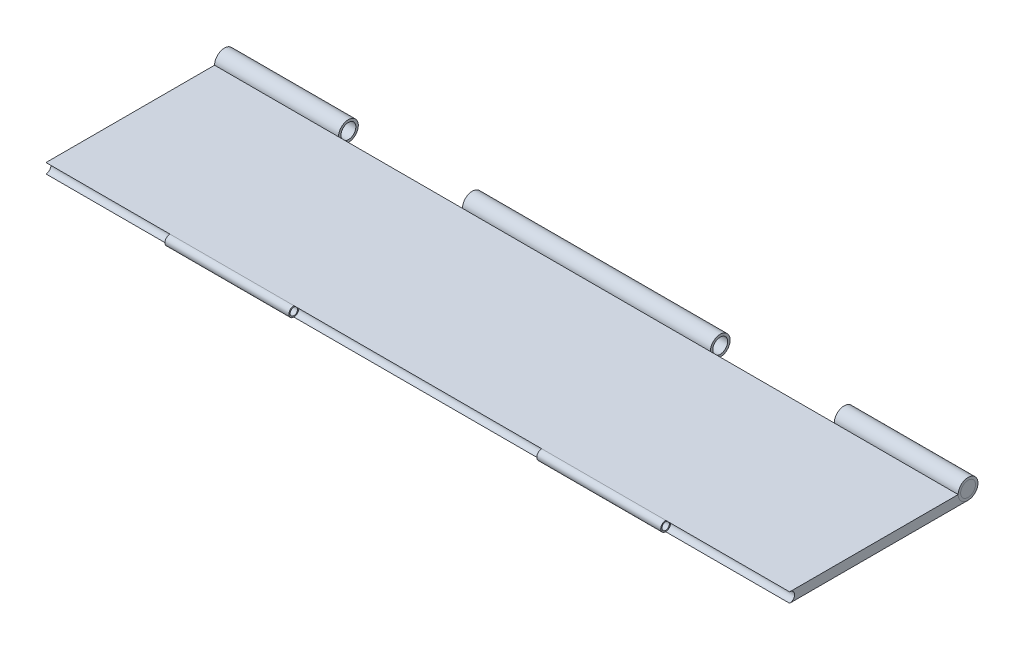
ISO-10303-21;
HEADER;
FILE_DESCRIPTION(('STEP AP214'),'2;1');
FILE_NAME('part.step','',(''),(''),'','','');
FILE_SCHEMA(('AUTOMOTIVE_DESIGN { 1 0 10303 214 1 1 1 1 }'));
ENDSEC;
DATA;
#1=APPLICATION_CONTEXT('core data for automotive mechanical design processes');
#2=APPLICATION_PROTOCOL_DEFINITION('international standard','automotive_design',2000,#1);
#3=PRODUCT_CONTEXT('',#1,'mechanical');
#4=PRODUCT('Part','Part','',(#3));
#5=PRODUCT_RELATED_PRODUCT_CATEGORY('part','',(#4));
#6=PRODUCT_DEFINITION_FORMATION('','',#4);
#7=PRODUCT_DEFINITION_CONTEXT('part definition',#1,'design');
#8=PRODUCT_DEFINITION('design','',#6,#7);
#9=PRODUCT_DEFINITION_SHAPE('','',#8);
#10=(LENGTH_UNIT() NAMED_UNIT(*) SI_UNIT(.MILLI.,.METRE.));
#11=(NAMED_UNIT(*) PLANE_ANGLE_UNIT() SI_UNIT($,.RADIAN.));
#12=(NAMED_UNIT(*) SI_UNIT($,.STERADIAN.) SOLID_ANGLE_UNIT());
#13=UNCERTAINTY_MEASURE_WITH_UNIT(LENGTH_MEASURE(1.E-05),#10,'distance_accuracy_value','');
#14=(GEOMETRIC_REPRESENTATION_CONTEXT(3) GLOBAL_UNCERTAINTY_ASSIGNED_CONTEXT((#13)) GLOBAL_UNIT_ASSIGNED_CONTEXT((#10,
#11,#12)) REPRESENTATION_CONTEXT('',''));
#15=CARTESIAN_POINT('',(0.,0.,0.));
#16=DIRECTION('',(0.,0.,1.));
#17=DIRECTION('',(1.,0.,0.));
#18=AXIS2_PLACEMENT_3D('',#15,#16,#17);
#19=CARTESIAN_POINT('',(98.0225988700565,8.,-5.95350282485887));
#20=DIRECTION('',(1.,0.,0.));
#21=DIRECTION('',(0.,0.,-1.));
#22=AXIS2_PLACEMENT_3D('',#19,#20,#21);
#23=PLANE('',#22);
#24=CARTESIAN_POINT('',(98.0225988700565,4.,-1.94350282485878));
#25=DIRECTION('',(1.,0.,0.));
#26=DIRECTION('',(0.,0.,-1.));
#27=AXIS2_PLACEMENT_3D('',#24,#25,#26);
#28=CIRCLE('',#27,4.);
#29=CARTESIAN_POINT('',(98.0225988700565,4.,-5.94350282485878));
#30=VERTEX_POINT('',#29);
#31=EDGE_CURVE('E66',#30,#30,#28,.F.);
#32=ORIENTED_EDGE('',*,*,#31,.T.);
#33=EDGE_LOOP('',(#32));
#34=FACE_BOUND('',#33,.T.);
#35=CARTESIAN_POINT('',(98.0225988700565,4.,-1.94350282485878));
#36=DIRECTION('',(1.,0.,0.));
#37=DIRECTION('',(0.,0.,-1.));
#38=AXIS2_PLACEMENT_3D('',#35,#36,#37);
#39=CIRCLE('',#38,3.);
#40=CARTESIAN_POINT('',(98.0225988700565,4.,-4.94350282485878));
#41=VERTEX_POINT('',#40);
#42=EDGE_CURVE('E74',#41,#41,#39,.F.);
#43=ORIENTED_EDGE('',*,*,#42,.F.);
#44=EDGE_LOOP('',(#43));
#45=FACE_BOUND('',#44,.T.);
#46=ADVANCED_FACE('F62',(#34,#45),#23,.F.);
#47=CARTESIAN_POINT('',(148.022598870057,4.,-1.94350282485876));
#48=DIRECTION('',(1.,0.,0.));
#49=DIRECTION('',(0.,0.,-1.));
#50=AXIS2_PLACEMENT_3D('',#47,#48,#49);
#51=PLANE('',#50);
#52=CARTESIAN_POINT('',(148.022598870057,4.,-1.94350282485876));
#53=DIRECTION('',(1.,0.,0.));
#54=DIRECTION('',(0.,0.,-1.));
#55=AXIS2_PLACEMENT_3D('',#52,#53,#54);
#56=CIRCLE('',#55,3.);
#57=CARTESIAN_POINT('',(148.022598870057,4.,-4.94350282485876));
#58=VERTEX_POINT('',#57);
#59=EDGE_CURVE('E12',#58,#58,#56,.T.);
#60=ORIENTED_EDGE('',*,*,#59,.F.);
#61=EDGE_LOOP('',(#60));
#62=FACE_BOUND('',#61,.T.);
#63=CARTESIAN_POINT('',(148.022598870057,4.,-1.94350282485876));
#64=DIRECTION('',(1.,0.,0.));
#65=DIRECTION('',(0.,0.,-1.));
#66=AXIS2_PLACEMENT_3D('',#63,#64,#65);
#67=CIRCLE('',#66,4.);
#68=CARTESIAN_POINT('',(148.022598870057,4.,-5.94350282485877));
#69=VERTEX_POINT('',#68);
#70=EDGE_CURVE('E70',#69,#69,#67,.T.);
#71=ORIENTED_EDGE('',*,*,#70,.T.);
#72=EDGE_LOOP('',(#71));
#73=FACE_BOUND('',#72,.T.);
#74=ADVANCED_FACE('F90',(#62,#73),#51,.T.);
#75=CARTESIAN_POINT('',(-151.977401129944,4.,-1.94350282485888));
#76=DIRECTION('',(1.,0.,0.));
#77=DIRECTION('',(0.,0.,-1.));
#78=AXIS2_PLACEMENT_3D('',#75,#76,#77);
#79=CYLINDRICAL_SURFACE('',#78,3.);
#80=ORIENTED_EDGE('',*,*,#42,.T.);
#81=EDGE_LOOP('',(#80));
#82=FACE_BOUND('',#81,.T.);
#83=ORIENTED_EDGE('',*,*,#59,.T.);
#84=EDGE_LOOP('',(#83));
#85=FACE_BOUND('',#84,.T.);
#86=ADVANCED_FACE('F64',(#82,#85),#79,.F.);
#87=CARTESIAN_POINT('',(-151.977401129944,4.,-1.94350282485888));
#88=DIRECTION('',(1.,0.,0.));
#89=DIRECTION('',(0.,0.,-1.));
#90=AXIS2_PLACEMENT_3D('',#87,#88,#89);
#91=CYLINDRICAL_SURFACE('',#90,4.);
#92=ORIENTED_EDGE('',*,*,#31,.F.);
#93=EDGE_LOOP('',(#92));
#94=FACE_BOUND('',#93,.T.);
#95=ORIENTED_EDGE('',*,*,#70,.F.);
#96=EDGE_LOOP('',(#95));
#97=FACE_BOUND('',#96,.T.);
#98=ADVANCED_FACE('F85',(#94,#97),#91,.T.);
#99=CLOSED_SHELL('',(#46,#74,#86,#98));
#100=MANIFOLD_SOLID_BREP('B2',#99);
#101=CARTESIAN_POINT('',(48.0225988700565,7.99999999999999,-5.95350282485887));
#102=DIRECTION('',(-1.,0.,0.));
#103=DIRECTION('',(0.,0.,1.));
#104=AXIS2_PLACEMENT_3D('',#101,#102,#103);
#105=PLANE('',#104);
#106=CARTESIAN_POINT('',(48.0225988700565,4.,-1.9435028248588));
#107=DIRECTION('',(-1.,0.,0.));
#108=DIRECTION('',(0.,0.,1.));
#109=AXIS2_PLACEMENT_3D('',#106,#107,#108);
#110=CIRCLE('',#109,4.);
#111=CARTESIAN_POINT('',(48.0225988700565,4.,2.0564971751412));
#112=VERTEX_POINT('',#111);
#113=EDGE_CURVE('E136',#112,#112,#110,.F.);
#114=ORIENTED_EDGE('',*,*,#113,.T.);
#115=EDGE_LOOP('',(#114));
#116=FACE_BOUND('',#115,.T.);
#117=CARTESIAN_POINT('',(48.0225988700565,4.,-1.9435028248588));
#118=DIRECTION('',(-1.,0.,0.));
#119=DIRECTION('',(0.,0.,1.));
#120=AXIS2_PLACEMENT_3D('',#117,#118,#119);
#121=CIRCLE('',#120,3.);
#122=CARTESIAN_POINT('',(48.0225988700565,4.,1.0564971751412));
#123=VERTEX_POINT('',#122);
#124=EDGE_CURVE('E140',#123,#123,#121,.F.);
#125=ORIENTED_EDGE('',*,*,#124,.F.);
#126=EDGE_LOOP('',(#125));
#127=FACE_BOUND('',#126,.T.);
#128=ADVANCED_FACE('F132',(#116,#127),#105,.F.);
#129=CARTESIAN_POINT('',(-51.9774011299435,8.,-5.95350282485887));
#130=DIRECTION('',(1.,0.,0.));
#131=DIRECTION('',(0.,0.,-1.));
#132=AXIS2_PLACEMENT_3D('',#129,#130,#131);
#133=PLANE('',#132);
#134=CARTESIAN_POINT('',(-51.9774011299435,4.,-1.94350282485884));
#135=DIRECTION('',(1.,0.,0.));
#136=DIRECTION('',(0.,0.,-1.));
#137=AXIS2_PLACEMENT_3D('',#134,#135,#136);
#138=CIRCLE('',#137,4.);
#139=CARTESIAN_POINT('',(-51.9774011299435,4.,-5.94350282485884));
#140=VERTEX_POINT('',#139);
#141=EDGE_CURVE('E146',#140,#140,#138,.F.);
#142=ORIENTED_EDGE('',*,*,#141,.T.);
#143=EDGE_LOOP('',(#142));
#144=FACE_BOUND('',#143,.T.);
#145=CARTESIAN_POINT('',(-51.9774011299435,4.,-1.94350282485884));
#146=DIRECTION('',(1.,0.,0.));
#147=DIRECTION('',(0.,0.,-1.));
#148=AXIS2_PLACEMENT_3D('',#145,#146,#147);
#149=CIRCLE('',#148,3.);
#150=CARTESIAN_POINT('',(-51.9774011299435,4.,-4.94350282485884));
#151=VERTEX_POINT('',#150);
#152=EDGE_CURVE('E61',#151,#151,#149,.F.);
#153=ORIENTED_EDGE('',*,*,#152,.F.);
#154=EDGE_LOOP('',(#153));
#155=FACE_BOUND('',#154,.T.);
#156=ADVANCED_FACE('F158',(#144,#155),#133,.F.);
#157=CARTESIAN_POINT('',(-151.977401129944,4.,-1.94350282485888));
#158=DIRECTION('',(1.,0.,0.));
#159=DIRECTION('',(0.,0.,-1.));
#160=AXIS2_PLACEMENT_3D('',#157,#158,#159);
#161=CYLINDRICAL_SURFACE('',#160,3.);
#162=ORIENTED_EDGE('',*,*,#124,.T.);
#163=EDGE_LOOP('',(#162));
#164=FACE_BOUND('',#163,.T.);
#165=ORIENTED_EDGE('',*,*,#152,.T.);
#166=EDGE_LOOP('',(#165));
#167=FACE_BOUND('',#166,.T.);
#168=ADVANCED_FACE('F157',(#164,#167),#161,.F.);
#169=CARTESIAN_POINT('',(-151.977401129944,4.,-1.94350282485888));
#170=DIRECTION('',(1.,0.,0.));
#171=DIRECTION('',(0.,0.,-1.));
#172=AXIS2_PLACEMENT_3D('',#169,#170,#171);
#173=CYLINDRICAL_SURFACE('',#172,4.);
#174=ORIENTED_EDGE('',*,*,#113,.F.);
#175=EDGE_LOOP('',(#174));
#176=FACE_BOUND('',#175,.T.);
#177=ORIENTED_EDGE('',*,*,#141,.F.);
#178=EDGE_LOOP('',(#177));
#179=FACE_BOUND('',#178,.T.);
#180=ADVANCED_FACE('F134',(#176,#179),#173,.T.);
#181=CLOSED_SHELL('',(#128,#156,#168,#180));
#182=MANIFOLD_SOLID_BREP('B7',#181);
#183=CARTESIAN_POINT('',(-101.977401129944,7.99999999999999,-5.95350282485887));
#184=DIRECTION('',(-1.,0.,0.));
#185=DIRECTION('',(0.,0.,1.));
#186=AXIS2_PLACEMENT_3D('',#183,#184,#185);
#187=PLANE('',#186);
#188=CARTESIAN_POINT('',(-101.977401129944,4.,-1.94350282485886));
#189=DIRECTION('',(-1.,0.,0.));
#190=DIRECTION('',(0.,0.,1.));
#191=AXIS2_PLACEMENT_3D('',#188,#189,#190);
#192=CIRCLE('',#191,4.);
#193=CARTESIAN_POINT('',(-101.977401129944,4.,2.05649717514114));
#194=VERTEX_POINT('',#193);
#195=EDGE_CURVE('E131',#194,#194,#192,.F.);
#196=ORIENTED_EDGE('',*,*,#195,.T.);
#197=EDGE_LOOP('',(#196));
#198=FACE_BOUND('',#197,.T.);
#199=CARTESIAN_POINT('',(-101.977401129944,4.,-1.94350282485886));
#200=DIRECTION('',(-1.,0.,0.));
#201=DIRECTION('',(0.,0.,1.));
#202=AXIS2_PLACEMENT_3D('',#199,#200,#201);
#203=CIRCLE('',#202,3.);
#204=CARTESIAN_POINT('',(-101.977401129944,4.,1.05649717514114));
#205=VERTEX_POINT('',#204);
#206=EDGE_CURVE('E208',#205,#205,#203,.F.);
#207=ORIENTED_EDGE('',*,*,#206,.F.);
#208=EDGE_LOOP('',(#207));
#209=FACE_BOUND('',#208,.T.);
#210=ADVANCED_FACE('F202',(#198,#209),#187,.F.);
#211=CARTESIAN_POINT('',(-151.977401129944,4.,-1.94350282485888));
#212=DIRECTION('',(1.,0.,0.));
#213=DIRECTION('',(0.,0.,-1.));
#214=AXIS2_PLACEMENT_3D('',#211,#212,#213);
#215=PLANE('',#214);
#216=CARTESIAN_POINT('',(-151.977401129944,4.,-1.94350282485888));
#217=DIRECTION('',(1.,0.,0.));
#218=DIRECTION('',(0.,0.,-1.));
#219=AXIS2_PLACEMENT_3D('',#216,#217,#218);
#220=CIRCLE('',#219,3.);
#221=CARTESIAN_POINT('',(-151.977401129944,4.,-4.94350282485888));
#222=VERTEX_POINT('',#221);
#223=EDGE_CURVE('E216',#222,#222,#220,.T.);
#224=ORIENTED_EDGE('',*,*,#223,.T.);
#225=EDGE_LOOP('',(#224));
#226=FACE_BOUND('',#225,.T.);
#227=CARTESIAN_POINT('',(-151.977401129944,4.,-1.94350282485888));
#228=DIRECTION('',(1.,0.,0.));
#229=DIRECTION('',(0.,0.,-1.));
#230=AXIS2_PLACEMENT_3D('',#227,#228,#229);
#231=CIRCLE('',#230,4.);
#232=CARTESIAN_POINT('',(-151.977401129944,4.,-5.94350282485888));
#233=VERTEX_POINT('',#232);
#234=EDGE_CURVE('E212',#233,#233,#231,.T.);
#235=ORIENTED_EDGE('',*,*,#234,.F.);
#236=EDGE_LOOP('',(#235));
#237=FACE_BOUND('',#236,.T.);
#238=ADVANCED_FACE('F222',(#226,#237),#215,.F.);
#239=CARTESIAN_POINT('',(-151.977401129944,4.,-1.94350282485888));
#240=DIRECTION('',(1.,0.,0.));
#241=DIRECTION('',(0.,0.,-1.));
#242=AXIS2_PLACEMENT_3D('',#239,#240,#241);
#243=CYLINDRICAL_SURFACE('',#242,3.);
#244=ORIENTED_EDGE('',*,*,#206,.T.);
#245=EDGE_LOOP('',(#244));
#246=FACE_BOUND('',#245,.T.);
#247=ORIENTED_EDGE('',*,*,#223,.F.);
#248=EDGE_LOOP('',(#247));
#249=FACE_BOUND('',#248,.T.);
#250=ADVANCED_FACE('F225',(#246,#249),#243,.F.);
#251=CARTESIAN_POINT('',(-151.977401129944,4.,-1.94350282485888));
#252=DIRECTION('',(1.,0.,0.));
#253=DIRECTION('',(0.,0.,-1.));
#254=AXIS2_PLACEMENT_3D('',#251,#252,#253);
#255=CYLINDRICAL_SURFACE('',#254,4.);
#256=ORIENTED_EDGE('',*,*,#195,.F.);
#257=EDGE_LOOP('',(#256));
#258=FACE_BOUND('',#257,.T.);
#259=ORIENTED_EDGE('',*,*,#234,.T.);
#260=EDGE_LOOP('',(#259));
#261=FACE_BOUND('',#260,.T.);
#262=ADVANCED_FACE('F227',(#258,#261),#255,.T.);
#263=CLOSED_SHELL('',(#210,#238,#250,#262));
#264=MANIFOLD_SOLID_BREP('B56',#263);
#265=CARTESIAN_POINT('',(-146.977401129943,4.,-1.94350282485887));
#266=DIRECTION('',(-1.,0.,0.));
#267=DIRECTION('',(0.,0.,1.));
#268=AXIS2_PLACEMENT_3D('',#265,#266,#267);
#269=CYLINDRICAL_SURFACE('',#268,3.);
#270=CARTESIAN_POINT('',(-146.977401129943,4.,-1.94350282485887));
#271=DIRECTION('',(-1.,0.,0.));
#272=DIRECTION('',(0.,0.,1.));
#273=AXIS2_PLACEMENT_3D('',#270,#271,#272);
#274=CIRCLE('',#273,3.);
#275=CARTESIAN_POINT('',(-146.977401129943,4.,1.05649717514113));
#276=VERTEX_POINT('',#275);
#277=EDGE_CURVE('E201',#276,#276,#274,.T.);
#278=ORIENTED_EDGE('',*,*,#277,.T.);
#279=EDGE_LOOP('',(#278));
#280=FACE_BOUND('',#279,.T.);
#281=CARTESIAN_POINT('',(-151.977401129943,4.,-1.94350282485888));
#282=DIRECTION('',(-1.,0.,0.));
#283=DIRECTION('',(0.,0.,1.));
#284=AXIS2_PLACEMENT_3D('',#281,#282,#283);
#285=CIRCLE('',#284,3.);
#286=CARTESIAN_POINT('',(-151.977401129943,4.,1.05649717514112));
#287=VERTEX_POINT('',#286);
#288=EDGE_CURVE('E275',#287,#287,#285,.T.);
#289=ORIENTED_EDGE('',*,*,#288,.F.);
#290=EDGE_LOOP('',(#289));
#291=FACE_BOUND('',#290,.T.);
#292=ADVANCED_FACE('F272',(#280,#291),#269,.T.);
#293=CARTESIAN_POINT('',(-146.977401129943,4.,-1.94350282485887));
#294=DIRECTION('',(-1.,0.,0.));
#295=DIRECTION('',(0.,0.,1.));
#296=AXIS2_PLACEMENT_3D('',#293,#294,#295);
#297=PLANE('',#296);
#298=ORIENTED_EDGE('',*,*,#277,.F.);
#299=EDGE_LOOP('',(#298));
#300=FACE_BOUND('',#299,.T.);
#301=ADVANCED_FACE('F287',(#300),#297,.F.);
#302=CARTESIAN_POINT('',(-151.977401129943,4.,-1.94350282485888));
#303=DIRECTION('',(-1.,0.,0.));
#304=DIRECTION('',(0.,0.,1.));
#305=AXIS2_PLACEMENT_3D('',#302,#303,#304);
#306=PLANE('',#305);
#307=ORIENTED_EDGE('',*,*,#288,.T.);
#308=EDGE_LOOP('',(#307));
#309=FACE_BOUND('',#308,.T.);
#310=ADVANCED_FACE('F284',(#309),#306,.T.);
#311=CLOSED_SHELL('',(#292,#301,#310));
#312=MANIFOLD_SOLID_BREP('B126',#311);
#313=CARTESIAN_POINT('',(143.022598870057,4.,-1.94350282485877));
#314=DIRECTION('',(1.,0.,0.));
#315=DIRECTION('',(0.,0.,-1.));
#316=AXIS2_PLACEMENT_3D('',#313,#314,#315);
#317=CYLINDRICAL_SURFACE('',#316,3.);
#318=CARTESIAN_POINT('',(143.022598870057,4.,-1.94350282485877));
#319=DIRECTION('',(1.,0.,0.));
#320=DIRECTION('',(0.,0.,-1.));
#321=AXIS2_PLACEMENT_3D('',#318,#319,#320);
#322=CIRCLE('',#321,3.);
#323=CARTESIAN_POINT('',(143.022598870057,4.,-4.94350282485877));
#324=VERTEX_POINT('',#323);
#325=EDGE_CURVE('E271',#324,#324,#322,.T.);
#326=ORIENTED_EDGE('',*,*,#325,.T.);
#327=EDGE_LOOP('',(#326));
#328=FACE_BOUND('',#327,.T.);
#329=CARTESIAN_POINT('',(148.022598870057,4.,-1.94350282485876));
#330=DIRECTION('',(1.,0.,0.));
#331=DIRECTION('',(0.,0.,-1.));
#332=AXIS2_PLACEMENT_3D('',#329,#330,#331);
#333=CIRCLE('',#332,3.);
#334=CARTESIAN_POINT('',(148.022598870057,4.,-4.94350282485876));
#335=VERTEX_POINT('',#334);
#336=EDGE_CURVE('E325',#335,#335,#333,.T.);
#337=ORIENTED_EDGE('',*,*,#336,.F.);
#338=EDGE_LOOP('',(#337));
#339=FACE_BOUND('',#338,.T.);
#340=ADVANCED_FACE('F322',(#328,#339),#317,.T.);
#341=CARTESIAN_POINT('',(143.022598870057,4.,-1.94350282485877));
#342=DIRECTION('',(1.,0.,0.));
#343=DIRECTION('',(0.,0.,-1.));
#344=AXIS2_PLACEMENT_3D('',#341,#342,#343);
#345=PLANE('',#344);
#346=ORIENTED_EDGE('',*,*,#325,.F.);
#347=EDGE_LOOP('',(#346));
#348=FACE_BOUND('',#347,.T.);
#349=ADVANCED_FACE('F337',(#348),#345,.F.);
#350=CARTESIAN_POINT('',(148.022598870057,4.,-1.94350282485876));
#351=DIRECTION('',(1.,0.,0.));
#352=DIRECTION('',(0.,0.,-1.));
#353=AXIS2_PLACEMENT_3D('',#350,#351,#352);
#354=PLANE('',#353);
#355=ORIENTED_EDGE('',*,*,#336,.T.);
#356=EDGE_LOOP('',(#355));
#357=FACE_BOUND('',#356,.T.);
#358=ADVANCED_FACE('F334',(#357),#354,.T.);
#359=CLOSED_SHELL('',(#340,#349,#358));
#360=MANIFOLD_SOLID_BREP('B196',#359);
#361=CARTESIAN_POINT('',(-151.977401129944,2.,70.0564971751411));
#362=DIRECTION('',(1.,0.,0.));
#363=DIRECTION('',(0.,0.,-1.));
#364=AXIS2_PLACEMENT_3D('',#361,#362,#363);
#365=CYLINDRICAL_SURFACE('',#364,2.);
#366=CARTESIAN_POINT('',(48.0225988700565,2.,70.0564971751412));
#367=DIRECTION('',(1.,0.,0.));
#368=DIRECTION('',(0.,0.,-1.));
#369=AXIS2_PLACEMENT_3D('',#366,#367,#368);
#370=CIRCLE('',#369,2.);
#371=CARTESIAN_POINT('',(48.0225988700565,4.,70.0564971751412));
#372=VERTEX_POINT('',#371);
#373=CARTESIAN_POINT('',(48.0225988700565,0.,70.0564971751412));
#374=VERTEX_POINT('',#373);
#375=EDGE_CURVE('E320',#372,#374,#370,.F.);
#376=ORIENTED_EDGE('',*,*,#375,.F.);
#377=DIRECTION('',(1.,0.,0.));
#378=VECTOR('',#377,1.);
#379=CARTESIAN_POINT('',(-151.977401129944,4.,70.0564971751412));
#380=LINE('',#379,#378);
#381=CARTESIAN_POINT('',(-51.9774011299435,4.,70.0564971751412));
#382=VERTEX_POINT('',#381);
#383=EDGE_CURVE('E385',#382,#372,#380,.T.);
#384=ORIENTED_EDGE('',*,*,#383,.F.);
#385=CARTESIAN_POINT('',(-51.9774011299435,2.,70.0564971751412));
#386=DIRECTION('',(1.,0.,0.));
#387=DIRECTION('',(0.,0.,-1.));
#388=AXIS2_PLACEMENT_3D('',#385,#386,#387);
#389=CIRCLE('',#388,2.);
#390=CARTESIAN_POINT('',(-51.9774011299435,0.,70.0564971751412));
#391=VERTEX_POINT('',#390);
#392=EDGE_CURVE('E430',#382,#391,#389,.F.);
#393=ORIENTED_EDGE('',*,*,#392,.T.);
#394=DIRECTION('',(1.,0.,0.));
#395=VECTOR('',#394,1.);
#396=CARTESIAN_POINT('',(-151.977401129944,0.,70.0564971751412));
#397=LINE('',#396,#395);
#398=EDGE_CURVE('E481',#391,#374,#397,.T.);
#399=ORIENTED_EDGE('',*,*,#398,.T.);
#400=EDGE_LOOP('',(#376,#384,#393,#399));
#401=FACE_BOUND('',#400,.T.);
#402=ADVANCED_FACE('F363',(#401),#365,.F.);
#403=CARTESIAN_POINT('',(-101.977401129944,2.,70.0564971751411));
#404=DIRECTION('',(1.,0.,0.));
#405=DIRECTION('',(0.,0.,-1.));
#406=AXIS2_PLACEMENT_3D('',#403,#404,#405);
#407=CIRCLE('',#406,2.);
#408=CARTESIAN_POINT('',(-101.977401129944,4.,70.0564971751412));
#409=VERTEX_POINT('',#408);
#410=CARTESIAN_POINT('',(-101.977401129944,0.,70.0564971751412));
#411=VERTEX_POINT('',#410);
#412=EDGE_CURVE('E462',#409,#411,#407,.F.);
#413=ORIENTED_EDGE('',*,*,#412,.F.);
#414=CARTESIAN_POINT('',(-151.977401129944,4.,70.0564971751411));
#415=VERTEX_POINT('',#414);
#416=EDGE_CURVE('E452',#415,#409,#380,.T.);
#417=ORIENTED_EDGE('',*,*,#416,.F.);
#418=CARTESIAN_POINT('',(-151.977401129944,2.,70.0564971751411));
#419=DIRECTION('',(1.,0.,0.));
#420=DIRECTION('',(0.,0.,-1.));
#421=AXIS2_PLACEMENT_3D('',#418,#419,#420);
#422=CIRCLE('',#421,2.);
#423=CARTESIAN_POINT('',(-151.977401129944,0.,70.0564971751412));
#424=VERTEX_POINT('',#423);
#425=EDGE_CURVE('E501',#424,#415,#422,.T.);
#426=ORIENTED_EDGE('',*,*,#425,.F.);
#427=EDGE_CURVE('E468',#424,#411,#397,.T.);
#428=ORIENTED_EDGE('',*,*,#427,.T.);
#429=EDGE_LOOP('',(#413,#417,#426,#428));
#430=FACE_BOUND('',#429,.T.);
#431=ADVANCED_FACE('F529',(#430),#365,.F.);
#432=CARTESIAN_POINT('',(-151.977401129943,4.,-1.94350282485876));
#433=DIRECTION('',(1.,0.,0.));
#434=DIRECTION('',(0.,0.,-1.));
#435=AXIS2_PLACEMENT_3D('',#432,#433,#434);
#436=PLANE('',#435);
#437=DIRECTION('',(0.,0.,1.));
#438=VECTOR('',#437,1.);
#439=CARTESIAN_POINT('',(-151.977401129943,0.,-1.94350282485876));
#440=LINE('',#439,#438);
#441=CARTESIAN_POINT('',(-151.977401129944,0.,-1.94350282485888));
#442=VERTEX_POINT('',#441);
#443=EDGE_CURVE('E463',#442,#424,#440,.T.);
#444=ORIENTED_EDGE('',*,*,#443,.T.);
#445=ORIENTED_EDGE('',*,*,#425,.T.);
#446=DIRECTION('',(0.,0.,1.));
#447=VECTOR('',#446,1.);
#448=CARTESIAN_POINT('',(-151.977401129943,4.,-1.94350282485876));
#449=LINE('',#448,#447);
#450=CARTESIAN_POINT('',(-151.977401129944,4.,2.05649717514113));
#451=VERTEX_POINT('',#450);
#452=EDGE_CURVE('E450',#451,#415,#449,.T.);
#453=ORIENTED_EDGE('',*,*,#452,.F.);
#454=CARTESIAN_POINT('',(-151.977401129944,4.,-1.94350282485888));
#455=DIRECTION('',(1.,0.,0.));
#456=DIRECTION('',(0.,0.,-1.));
#457=AXIS2_PLACEMENT_3D('',#454,#455,#456);
#458=CIRCLE('',#457,4.);
#459=EDGE_CURVE('E512',#451,#442,#458,.T.);
#460=ORIENTED_EDGE('',*,*,#459,.T.);
#461=EDGE_LOOP('',(#444,#445,#453,#460));
#462=FACE_BOUND('',#461,.T.);
#463=ADVANCED_FACE('F365',(#462),#436,.F.);
#464=CARTESIAN_POINT('',(148.022598870057,4.,-1.94350282485876));
#465=DIRECTION('',(-1.,0.,0.));
#466=DIRECTION('',(0.,0.,1.));
#467=AXIS2_PLACEMENT_3D('',#464,#465,#466);
#468=PLANE('',#467);
#469=DIRECTION('',(0.,0.,-1.));
#470=VECTOR('',#469,1.);
#471=CARTESIAN_POINT('',(148.022598870057,4.,-1.94350282485876));
#472=LINE('',#471,#470);
#473=CARTESIAN_POINT('',(148.022598870056,4.,70.0564971751412));
#474=VERTEX_POINT('',#473);
#475=CARTESIAN_POINT('',(148.022598870057,4.,2.05649717514124));
#476=VERTEX_POINT('',#475);
#477=EDGE_CURVE('E459',#474,#476,#472,.T.);
#478=ORIENTED_EDGE('',*,*,#477,.F.);
#479=CARTESIAN_POINT('',(148.022598870056,2.,70.0564971751412));
#480=DIRECTION('',(1.,0.,0.));
#481=DIRECTION('',(0.,0.,-1.));
#482=AXIS2_PLACEMENT_3D('',#479,#480,#481);
#483=CIRCLE('',#482,2.);
#484=CARTESIAN_POINT('',(148.022598870056,0.,70.0564971751412));
#485=VERTEX_POINT('',#484);
#486=EDGE_CURVE('E446',#485,#474,#483,.T.);
#487=ORIENTED_EDGE('',*,*,#486,.F.);
#488=DIRECTION('',(0.,0.,-1.));
#489=VECTOR('',#488,1.);
#490=CARTESIAN_POINT('',(148.022598870057,0.,-1.94350282485876));
#491=LINE('',#490,#489);
#492=CARTESIAN_POINT('',(148.022598870057,0.,-1.94350282485876));
#493=VERTEX_POINT('',#492);
#494=EDGE_CURVE('E470',#485,#493,#491,.T.);
#495=ORIENTED_EDGE('',*,*,#494,.T.);
#496=CARTESIAN_POINT('',(148.022598870057,4.,-1.94350282485876));
#497=DIRECTION('',(1.,0.,0.));
#498=DIRECTION('',(0.,0.,-1.));
#499=AXIS2_PLACEMENT_3D('',#496,#497,#498);
#500=CIRCLE('',#499,4.);
#501=EDGE_CURVE('E510',#476,#493,#500,.T.);
#502=ORIENTED_EDGE('',*,*,#501,.F.);
#503=EDGE_LOOP('',(#478,#487,#495,#502));
#504=FACE_BOUND('',#503,.T.);
#505=ADVANCED_FACE('F521',(#504),#468,.F.);
#506=CARTESIAN_POINT('',(0.,4.,0.));
#507=DIRECTION('',(0.,1.,0.));
#508=DIRECTION('',(0.,0.,1.));
#509=AXIS2_PLACEMENT_3D('',#506,#507,#508);
#510=PLANE('',#509);
#511=DIRECTION('',(1.,0.,0.));
#512=VECTOR('',#511,1.);
#513=CARTESIAN_POINT('',(-151.977401129944,4.,2.05649717514113));
#514=LINE('',#513,#512);
#515=EDGE_CURVE('E467',#451,#476,#514,.T.);
#516=ORIENTED_EDGE('',*,*,#515,.F.);
#517=ORIENTED_EDGE('',*,*,#452,.T.);
#518=ORIENTED_EDGE('',*,*,#416,.T.);
#519=EDGE_CURVE('E455',#409,#382,#380,.T.);
#520=ORIENTED_EDGE('',*,*,#519,.T.);
#521=ORIENTED_EDGE('',*,*,#383,.T.);
#522=CARTESIAN_POINT('',(98.0225988700565,4.,70.0564971751412));
#523=VERTEX_POINT('',#522);
#524=EDGE_CURVE('E435',#372,#523,#380,.T.);
#525=ORIENTED_EDGE('',*,*,#524,.T.);
#526=EDGE_CURVE('E443',#523,#474,#380,.T.);
#527=ORIENTED_EDGE('',*,*,#526,.T.);
#528=ORIENTED_EDGE('',*,*,#477,.T.);
#529=EDGE_LOOP('',(#516,#517,#518,#520,#521,#525,#527,#528));
#530=FACE_BOUND('',#529,.T.);
#531=ADVANCED_FACE('F454',(#530),#510,.T.);
#532=CARTESIAN_POINT('',(0.,0.,0.));
#533=DIRECTION('',(0.,1.,0.));
#534=DIRECTION('',(0.,0.,1.));
#535=AXIS2_PLACEMENT_3D('',#532,#533,#534);
#536=PLANE('',#535);
#537=ORIENTED_EDGE('',*,*,#443,.F.);
#538=DIRECTION('',(-1.,0.,0.));
#539=VECTOR('',#538,1.);
#540=CARTESIAN_POINT('',(-151.977401129943,0.,-1.94350282485876));
#541=LINE('',#540,#539);
#542=EDGE_CURVE('E474',#493,#442,#541,.T.);
#543=ORIENTED_EDGE('',*,*,#542,.F.);
#544=ORIENTED_EDGE('',*,*,#494,.F.);
#545=CARTESIAN_POINT('',(98.0225988700565,0.,70.0564971751412));
#546=VERTEX_POINT('',#545);
#547=EDGE_CURVE('E466',#546,#485,#397,.T.);
#548=ORIENTED_EDGE('',*,*,#547,.F.);
#549=EDGE_CURVE('E438',#374,#546,#397,.T.);
#550=ORIENTED_EDGE('',*,*,#549,.F.);
#551=ORIENTED_EDGE('',*,*,#398,.F.);
#552=EDGE_CURVE('E471',#411,#391,#397,.T.);
#553=ORIENTED_EDGE('',*,*,#552,.F.);
#554=ORIENTED_EDGE('',*,*,#427,.F.);
#555=EDGE_LOOP('',(#537,#543,#544,#548,#550,#551,#553,#554));
#556=FACE_BOUND('',#555,.T.);
#557=ADVANCED_FACE('F489',(#556),#536,.F.);
#558=CARTESIAN_POINT('',(-151.977401129944,4.,-1.94350282485888));
#559=DIRECTION('',(1.,0.,0.));
#560=DIRECTION('',(0.,0.,-1.));
#561=AXIS2_PLACEMENT_3D('',#558,#559,#560);
#562=CYLINDRICAL_SURFACE('',#561,4.);
#563=ORIENTED_EDGE('',*,*,#515,.T.);
#564=ORIENTED_EDGE('',*,*,#501,.T.);
#565=ORIENTED_EDGE('',*,*,#542,.T.);
#566=ORIENTED_EDGE('',*,*,#459,.F.);
#567=EDGE_LOOP('',(#563,#564,#565,#566));
#568=FACE_BOUND('',#567,.T.);
#569=ADVANCED_FACE('F517',(#568),#562,.F.);
#570=ORIENTED_EDGE('',*,*,#526,.F.);
#571=CARTESIAN_POINT('',(98.0225988700565,2.,70.0564971751412));
#572=DIRECTION('',(1.,0.,0.));
#573=DIRECTION('',(0.,0.,-1.));
#574=AXIS2_PLACEMENT_3D('',#571,#572,#573);
#575=CIRCLE('',#574,2.);
#576=EDGE_CURVE('E371',#523,#546,#575,.F.);
#577=ORIENTED_EDGE('',*,*,#576,.T.);
#578=ORIENTED_EDGE('',*,*,#547,.T.);
#579=ORIENTED_EDGE('',*,*,#486,.T.);
#580=EDGE_LOOP('',(#570,#577,#578,#579));
#581=FACE_BOUND('',#580,.T.);
#582=ADVANCED_FACE('F444',(#581),#365,.F.);
#583=CARTESIAN_POINT('',(-51.9774011299435,2.,70.0564971751411));
#584=DIRECTION('',(1.,0.,0.));
#585=DIRECTION('',(0.,0.,-1.));
#586=AXIS2_PLACEMENT_3D('',#583,#584,#585);
#587=PLANE('',#586);
#588=CARTESIAN_POINT('',(-51.9774011299435,2.,70.0564971751411));
#589=DIRECTION('',(1.,0.,0.));
#590=DIRECTION('',(0.,0.,-1.));
#591=AXIS2_PLACEMENT_3D('',#588,#589,#590);
#592=CIRCLE('',#591,2.);
#593=EDGE_CURVE('E495',#382,#391,#592,.T.);
#594=ORIENTED_EDGE('',*,*,#593,.T.);
#595=ORIENTED_EDGE('',*,*,#392,.F.);
#596=EDGE_LOOP('',(#594,#595));
#597=FACE_BOUND('',#596,.T.);
#598=CARTESIAN_POINT('',(-51.9774011299435,2.,70.0564971751411));
#599=DIRECTION('',(1.,0.,0.));
#600=DIRECTION('',(0.,0.,-1.));
#601=AXIS2_PLACEMENT_3D('',#598,#599,#600);
#602=CIRCLE('',#601,1.5);
#603=CARTESIAN_POINT('',(-51.9774011299435,2.,68.5564971751411));
#604=VERTEX_POINT('',#603);
#605=EDGE_CURVE('E503',#604,#604,#602,.T.);
#606=ORIENTED_EDGE('',*,*,#605,.F.);
#607=EDGE_LOOP('',(#606));
#608=FACE_BOUND('',#607,.T.);
#609=ADVANCED_FACE('F498',(#597,#608),#587,.T.);
#610=CARTESIAN_POINT('',(-101.977401129944,2.,70.0564971751411));
#611=DIRECTION('',(1.,0.,0.));
#612=DIRECTION('',(0.,0.,-1.));
#613=AXIS2_PLACEMENT_3D('',#610,#611,#612);
#614=PLANE('',#613);
#615=CARTESIAN_POINT('',(-101.977401129944,2.,70.0564971751411));
#616=DIRECTION('',(1.,0.,0.));
#617=DIRECTION('',(0.,0.,-1.));
#618=AXIS2_PLACEMENT_3D('',#615,#616,#617);
#619=CIRCLE('',#618,2.);
#620=EDGE_CURVE('E497',#409,#411,#619,.T.);
#621=ORIENTED_EDGE('',*,*,#620,.F.);
#622=ORIENTED_EDGE('',*,*,#412,.T.);
#623=EDGE_LOOP('',(#621,#622));
#624=FACE_BOUND('',#623,.T.);
#625=CARTESIAN_POINT('',(-101.977401129944,2.,70.0564971751411));
#626=DIRECTION('',(1.,0.,0.));
#627=DIRECTION('',(0.,0.,-1.));
#628=AXIS2_PLACEMENT_3D('',#625,#626,#627);
#629=CIRCLE('',#628,1.5);
#630=CARTESIAN_POINT('',(-101.977401129944,2.,68.5564971751411));
#631=VERTEX_POINT('',#630);
#632=EDGE_CURVE('E506',#631,#631,#629,.T.);
#633=ORIENTED_EDGE('',*,*,#632,.T.);
#634=EDGE_LOOP('',(#633));
#635=FACE_BOUND('',#634,.T.);
#636=ADVANCED_FACE('F527',(#624,#635),#614,.F.);
#637=CARTESIAN_POINT('',(-51.9774011299435,2.,70.0564971751411));
#638=DIRECTION('',(-1.,0.,0.));
#639=DIRECTION('',(0.,0.,1.));
#640=AXIS2_PLACEMENT_3D('',#637,#638,#639);
#641=CYLINDRICAL_SURFACE('',#640,2.);
#642=ORIENTED_EDGE('',*,*,#519,.F.);
#643=ORIENTED_EDGE('',*,*,#620,.T.);
#644=ORIENTED_EDGE('',*,*,#552,.T.);
#645=ORIENTED_EDGE('',*,*,#593,.F.);
#646=EDGE_LOOP('',(#642,#643,#644,#645));
#647=FACE_BOUND('',#646,.T.);
#648=ADVANCED_FACE('F494',(#647),#641,.T.);
#649=CARTESIAN_POINT('',(-51.9774011299435,2.,70.0564971751411));
#650=DIRECTION('',(-1.,0.,0.));
#651=DIRECTION('',(0.,0.,1.));
#652=AXIS2_PLACEMENT_3D('',#649,#650,#651);
#653=CYLINDRICAL_SURFACE('',#652,1.5);
#654=ORIENTED_EDGE('',*,*,#605,.T.);
#655=EDGE_LOOP('',(#654));
#656=FACE_BOUND('',#655,.T.);
#657=ORIENTED_EDGE('',*,*,#632,.F.);
#658=EDGE_LOOP('',(#657));
#659=FACE_BOUND('',#658,.T.);
#660=ADVANCED_FACE('F580',(#656,#659),#653,.F.);
#661=CARTESIAN_POINT('',(48.0225988700565,2.,70.0564971751412));
#662=DIRECTION('',(1.,0.,0.));
#663=DIRECTION('',(0.,0.,-1.));
#664=AXIS2_PLACEMENT_3D('',#661,#662,#663);
#665=CYLINDRICAL_SURFACE('',#664,2.);
#666=ORIENTED_EDGE('',*,*,#524,.F.);
#667=CARTESIAN_POINT('',(48.0225988700565,2.,70.0564971751412));
#668=DIRECTION('',(1.,0.,0.));
#669=DIRECTION('',(0.,0.,-1.));
#670=AXIS2_PLACEMENT_3D('',#667,#668,#669);
#671=CIRCLE('',#670,2.);
#672=EDGE_CURVE('E439',#372,#374,#671,.T.);
#673=ORIENTED_EDGE('',*,*,#672,.T.);
#674=ORIENTED_EDGE('',*,*,#549,.T.);
#675=CARTESIAN_POINT('',(98.0225988700565,2.,70.0564971751412));
#676=DIRECTION('',(1.,0.,0.));
#677=DIRECTION('',(0.,0.,-1.));
#678=AXIS2_PLACEMENT_3D('',#675,#676,#677);
#679=CIRCLE('',#678,2.);
#680=EDGE_CURVE('E377',#523,#546,#679,.T.);
#681=ORIENTED_EDGE('',*,*,#680,.F.);
#682=EDGE_LOOP('',(#666,#673,#674,#681));
#683=FACE_BOUND('',#682,.T.);
#684=ADVANCED_FACE('F432',(#683),#665,.T.);
#685=CARTESIAN_POINT('',(48.0225988700565,2.,70.0564971751412));
#686=DIRECTION('',(1.,0.,0.));
#687=DIRECTION('',(0.,0.,-1.));
#688=AXIS2_PLACEMENT_3D('',#685,#686,#687);
#689=PLANE('',#688);
#690=CARTESIAN_POINT('',(48.0225988700565,2.,70.0564971751412));
#691=DIRECTION('',(1.,0.,0.));
#692=DIRECTION('',(0.,0.,-1.));
#693=AXIS2_PLACEMENT_3D('',#690,#691,#692);
#694=CIRCLE('',#693,1.5);
#695=CARTESIAN_POINT('',(48.0225988700565,2.,68.5564971751412));
#696=VERTEX_POINT('',#695);
#697=EDGE_CURVE('E440',#696,#696,#694,.T.);
#698=ORIENTED_EDGE('',*,*,#697,.T.);
#699=EDGE_LOOP('',(#698));
#700=FACE_BOUND('',#699,.T.);
#701=ORIENTED_EDGE('',*,*,#672,.F.);
#702=ORIENTED_EDGE('',*,*,#375,.T.);
#703=EDGE_LOOP('',(#701,#702));
#704=FACE_BOUND('',#703,.T.);
#705=ADVANCED_FACE('F579',(#700,#704),#689,.F.);
#706=CARTESIAN_POINT('',(98.0225988700565,2.,70.0564971751412));
#707=DIRECTION('',(1.,0.,0.));
#708=DIRECTION('',(0.,0.,-1.));
#709=AXIS2_PLACEMENT_3D('',#706,#707,#708);
#710=PLANE('',#709);
#711=CARTESIAN_POINT('',(98.0225988700565,2.,70.0564971751412));
#712=DIRECTION('',(1.,0.,0.));
#713=DIRECTION('',(0.,0.,-1.));
#714=AXIS2_PLACEMENT_3D('',#711,#712,#713);
#715=CIRCLE('',#714,1.5);
#716=CARTESIAN_POINT('',(98.0225988700565,2.,68.5564971751412));
#717=VERTEX_POINT('',#716);
#718=EDGE_CURVE('E659',#717,#717,#715,.T.);
#719=ORIENTED_EDGE('',*,*,#718,.F.);
#720=EDGE_LOOP('',(#719));
#721=FACE_BOUND('',#720,.T.);
#722=ORIENTED_EDGE('',*,*,#680,.T.);
#723=ORIENTED_EDGE('',*,*,#576,.F.);
#724=EDGE_LOOP('',(#722,#723));
#725=FACE_BOUND('',#724,.T.);
#726=ADVANCED_FACE('F426',(#721,#725),#710,.T.);
#727=CARTESIAN_POINT('',(48.0225988700565,2.,70.0564971751412));
#728=DIRECTION('',(1.,0.,0.));
#729=DIRECTION('',(0.,0.,-1.));
#730=AXIS2_PLACEMENT_3D('',#727,#728,#729);
#731=CYLINDRICAL_SURFACE('',#730,1.5);
#732=ORIENTED_EDGE('',*,*,#697,.F.);
#733=EDGE_LOOP('',(#732));
#734=FACE_BOUND('',#733,.T.);
#735=ORIENTED_EDGE('',*,*,#718,.T.);
#736=EDGE_LOOP('',(#735));
#737=FACE_BOUND('',#736,.T.);
#738=ADVANCED_FACE('F600',(#734,#737),#731,.F.);
#739=CLOSED_SHELL('',(#402,#431,#463,#505,#531,#557,#569,#582,#609,#636,#648,#660,#684,#705,
#726,#738));
#740=MANIFOLD_SOLID_BREP('B266',#739);
#741=ADVANCED_BREP_SHAPE_REPRESENTATION('',(#18,#100,#182,#264,#312,#360,#740),#14);
#742=SHAPE_DEFINITION_REPRESENTATION(#9,#741);
ENDSEC;
END-ISO-10303-21;
